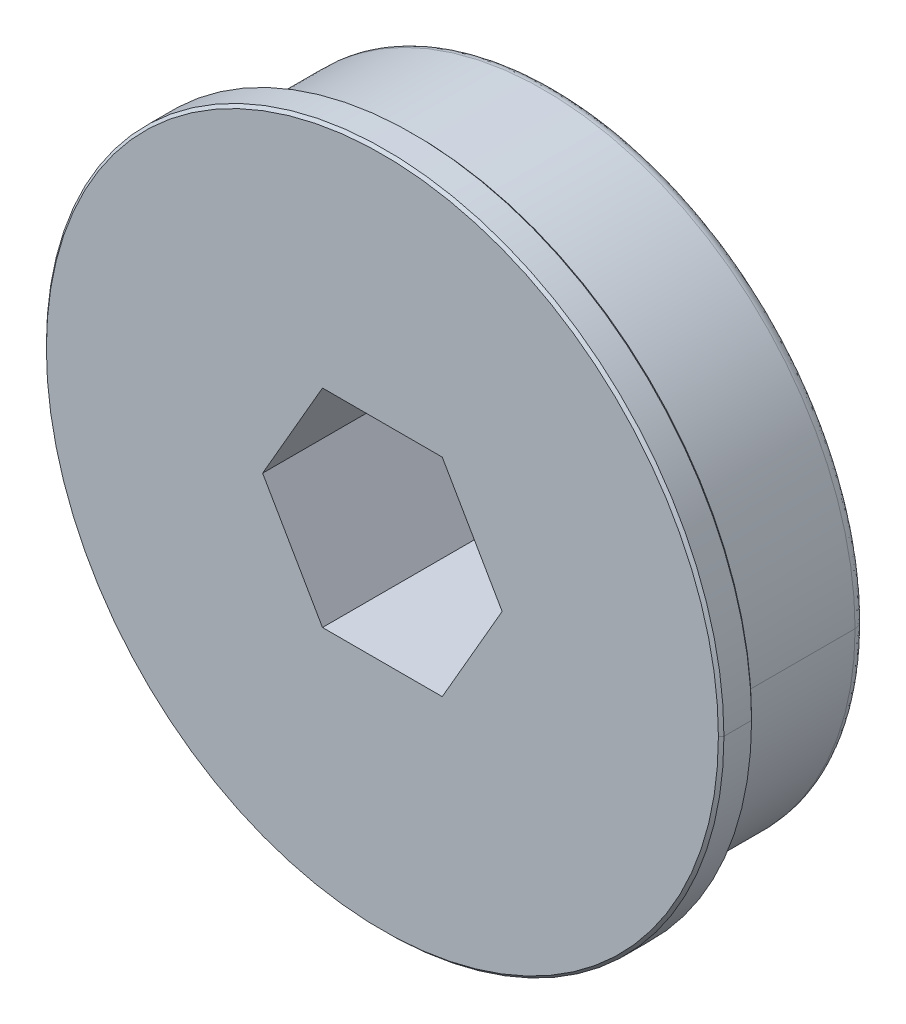
ISO-10303-21;
HEADER;
FILE_DESCRIPTION(('STEP AP214'),'2;1');
FILE_NAME('part.step','',(''),(''),'','','');
FILE_SCHEMA(('AUTOMOTIVE_DESIGN { 1 0 10303 214 1 1 1 1 }'));
ENDSEC;
DATA;
#1=APPLICATION_CONTEXT('core data for automotive mechanical design processes');
#2=APPLICATION_PROTOCOL_DEFINITION('international standard','automotive_design',2000,#1);
#3=PRODUCT_CONTEXT('',#1,'mechanical');
#4=PRODUCT('Part','Part','',(#3));
#5=PRODUCT_RELATED_PRODUCT_CATEGORY('part','',(#4));
#6=PRODUCT_DEFINITION_FORMATION('','',#4);
#7=PRODUCT_DEFINITION_CONTEXT('part definition',#1,'design');
#8=PRODUCT_DEFINITION('design','',#6,#7);
#9=PRODUCT_DEFINITION_SHAPE('','',#8);
#10=(LENGTH_UNIT() NAMED_UNIT(*) SI_UNIT(.MILLI.,.METRE.));
#11=(NAMED_UNIT(*) PLANE_ANGLE_UNIT() SI_UNIT($,.RADIAN.));
#12=(NAMED_UNIT(*) SI_UNIT($,.STERADIAN.) SOLID_ANGLE_UNIT());
#13=UNCERTAINTY_MEASURE_WITH_UNIT(LENGTH_MEASURE(1.E-05),#10,'distance_accuracy_value','');
#14=(GEOMETRIC_REPRESENTATION_CONTEXT(3) GLOBAL_UNCERTAINTY_ASSIGNED_CONTEXT((#13)) GLOBAL_UNIT_ASSIGNED_CONTEXT((#10,
#11,#12)) REPRESENTATION_CONTEXT('',''));
#15=CARTESIAN_POINT('',(0.,0.,0.));
#16=DIRECTION('',(0.,0.,1.));
#17=DIRECTION('',(1.,0.,0.));
#18=AXIS2_PLACEMENT_3D('',#15,#16,#17);
#19=CARTESIAN_POINT('',(13.7795,0.,0.));
#20=CARTESIAN_POINT('',(13.7795,-27.559,0.));
#21=CARTESIAN_POINT('',(-13.7795,-27.559,0.));
#22=CARTESIAN_POINT('',(-13.7795,0.,0.));
#23=CARTESIAN_POINT('',(14.0770795103145,0.,0.));
#24=CARTESIAN_POINT('',(14.0770795103145,-28.1541590206289,0.));
#25=CARTESIAN_POINT('',(-14.0770795103144,-28.1541590206289,0.));
#26=CARTESIAN_POINT('',(-14.0770795103145,0.,0.));
#27=CARTESIAN_POINT('',(14.2875,0.,0.210420489685535));
#28=CARTESIAN_POINT('',(14.2875,-28.575,0.210420489685535));
#29=CARTESIAN_POINT('',(-14.2875,-28.575,0.210420489685535));
#30=CARTESIAN_POINT('',(-14.2875,0.,0.210420489685535));
#31=CARTESIAN_POINT('',(14.2875,0.,0.508));
#32=CARTESIAN_POINT('',(14.2875,-28.575,0.508));
#33=CARTESIAN_POINT('',(-14.2875,-28.575,0.508));
#34=CARTESIAN_POINT('',(-14.2875,0.,0.508));
#35=(BOUNDED_SURFACE() B_SPLINE_SURFACE(3,3,((#19,#20,#21,#22),(#23,#24,#25,#26),(#27,#28,#29,
#30),(#31,#32,#33,#34)),.UNSPECIFIED.,.F.,.F.,.F.) B_SPLINE_SURFACE_WITH_KNOTS((4,4),(4,4),(0.,
1.),(0.,1.),.UNSPECIFIED.) GEOMETRIC_REPRESENTATION_ITEM() RATIONAL_B_SPLINE_SURFACE(((1.,
0.333333333333334,0.333333333333334,1.),(0.804737854124368,0.268245951374789,0.268245951374789,
0.804737854124368),(0.804737854124368,0.268245951374789,0.268245951374789,0.804737854124368),
(1.,0.333333333333334,0.333333333333334,1.))) REPRESENTATION_ITEM('') SURFACE());
#36=CARTESIAN_POINT('',(13.7795,0.,0.));
#37=CARTESIAN_POINT('',(13.7795162122622,-0.421234433545117,0.));
#38=CARTESIAN_POINT('',(13.7507729119708,-1.0505802437931,0.));
#39=CARTESIAN_POINT('',(13.6668957289328,-1.78043180229378,0.));
#40=CARTESIAN_POINT('',(13.6123713042394,-2.14426127651363,0.));
#41=CARTESIAN_POINT('',(13.581962633599,-2.32590193736593,0.));
#42=CARTESIAN_POINT('',(13.5682561051188,-2.40368920424742,0.));
#43=CARTESIAN_POINT('',(13.558968588118,-2.45553433091805,0.));
#44=CARTESIAN_POINT('',(13.5545355796113,-2.47990633622322,0.));
#45=CARTESIAN_POINT('',(13.4681882358548,-2.9466165925518,0.));
#46=CARTESIAN_POINT('',(13.315057365973,-3.59665927264263,0.));
#47=CARTESIAN_POINT('',(13.0817543937846,-4.33956822099774,0.));
#48=CARTESIAN_POINT('',(12.9514403350255,-4.7071541505709,0.));
#49=CARTESIAN_POINT('',(12.8828676624797,-4.88997997920639,0.));
#50=CARTESIAN_POINT('',(12.8527474507102,-4.96812666230351,0.));
#51=CARTESIAN_POINT('',(12.8325046598559,-5.02017839693249,0.));
#52=CARTESIAN_POINT('',(12.8227255948526,-5.04511098862723,0.));
#53=CARTESIAN_POINT('',(12.6406946886852,-5.50496203889733,0.));
#54=CARTESIAN_POINT('',(12.3523725033752,-6.13807724855982,0.));
#55=CARTESIAN_POINT('',(11.9611562114581,-6.84856068195707,0.));
#56=CARTESIAN_POINT('',(11.7518379632357,-7.19676465418679,0.));
#57=CARTESIAN_POINT('',(11.6591922635124,-7.34448683989904,0.));
#58=CARTESIAN_POINT('',(11.5967756016843,-7.44263316635155,0.));
#59=CARTESIAN_POINT('',(11.5658997282582,-7.4905308632128,0.));
#60=CARTESIAN_POINT('',(11.0130583441056,-8.33621173369481,0.));
#61=CARTESIAN_POINT('',(10.41595281911,-9.07115041119353,0.));
#62=CARTESIAN_POINT('',(9.40739042748505,-10.0797916314433,0.));
#63=CARTESIAN_POINT('',(8.87983719275512,-10.5556771559404,0.));
#64=CARTESIAN_POINT('',(8.22363235079802,-11.0611155346717,0.));
#65=CARTESIAN_POINT('',(7.88534841279309,-11.3013943740753,0.));
#66=CARTESIAN_POINT('',(7.73818782857104,-11.4017052302563,0.));
#67=CARTESIAN_POINT('',(7.63959593827889,-11.4679867367598,0.));
#68=CARTESIAN_POINT('',(7.58897578524338,-11.5015386025939,0.));
#69=CARTESIAN_POINT('',(7.15068488898815,-11.788108000785,0.));
#70=CARTESIAN_POINT('',(6.54997648985598,-12.1389840472023,0.));
#71=CARTESIAN_POINT('',(5.82058908364938,-12.4937105868068,0.));
#72=CARTESIAN_POINT('',(5.44875514540798,-12.6574166446385,0.));
#73=CARTESIAN_POINT('',(5.26105311750275,-12.7358553705617,0.));
#74=CARTESIAN_POINT('',(5.18022687866097,-12.7687403310303,0.));
#75=CARTESIAN_POINT('',(5.12625771663385,-12.7905010521526,0.));
#76=CARTESIAN_POINT('',(5.09811984490809,-12.8017399192917,0.));
#77=CARTESIAN_POINT('',(4.65682033840379,-12.9764654976591,0.));
#78=CARTESIAN_POINT('',(4.02471465818891,-13.1919810037368,0.));
#79=CARTESIAN_POINT('',(3.27134245990616,-13.3888929381443,0.));
#80=CARTESIAN_POINT('',(2.89067746792344,-13.4737181996772,0.));
#81=CARTESIAN_POINT('',(2.69935024872175,-13.5127231540259,0.));
#82=CARTESIAN_POINT('',(2.61713971409023,-13.5287093466573,0.));
#83=CARTESIAN_POINT('',(2.56228532323063,-13.5392045381059,0.));
#84=CARTESIAN_POINT('',(2.53324732644344,-13.5446647616305,0.));
#85=CARTESIAN_POINT('',(1.67896161734411,-13.7027863229975,0.));
#86=CARTESIAN_POINT('',(0.842468867097374,-13.7794675754757,0.));
#87=CARTESIAN_POINT('',(-0.421234433548683,-13.7795162122622,0.));
#88=CARTESIAN_POINT('',(-1.05058024379934,-13.7507729119708,0.));
#89=CARTESIAN_POINT('',(-1.78043180229845,-13.6668957289328,0.));
#90=CARTESIAN_POINT('',(-2.14426127651636,-13.6123713042393,0.));
#91=CARTESIAN_POINT('',(-2.32590193736739,-13.581962633599,0.));
#92=CARTESIAN_POINT('',(-2.40368920424828,-13.5682561051187,0.));
#93=CARTESIAN_POINT('',(-2.45553433091849,-13.5589685881179,0.));
#94=CARTESIAN_POINT('',(-2.47990633622205,-13.5545355796115,0.));
#95=CARTESIAN_POINT('',(-2.94661659257077,-13.4681882358506,0.));
#96=CARTESIAN_POINT('',(-3.59665927267583,-13.3150573659656,0.));
#97=CARTESIAN_POINT('',(-4.33956822102263,-13.0817543937791,0.));
#98=CARTESIAN_POINT('',(-4.70715415058543,-12.9514403350222,0.));
#99=CARTESIAN_POINT('',(-4.88997997921418,-12.882867662478,0.));
#100=CARTESIAN_POINT('',(-4.96812666230807,-12.8527474507091,0.));
#101=CARTESIAN_POINT('',(-5.02017839693483,-12.8325046598554,0.));
#102=CARTESIAN_POINT('',(-5.0451109886264,-12.8227255948531,0.));
#103=CARTESIAN_POINT('',(-5.50496203891068,-12.6406946886764,0.));
#104=CARTESIAN_POINT('',(-6.13807724858317,-12.3523725033599,0.));
#105=CARTESIAN_POINT('',(-6.84856068197457,-11.9611562114467,0.));
#106=CARTESIAN_POINT('',(-7.196764654197,-11.751837963229,0.));
#107=CARTESIAN_POINT('',(-7.34448683990519,-11.6591922635084,0.));
#108=CARTESIAN_POINT('',(-7.44263316635478,-11.5967756016822,0.));
#109=CARTESIAN_POINT('',(-7.49053086321308,-11.565899728258,0.));
#110=CARTESIAN_POINT('',(-8.33621173369039,-11.0130583441085,0.));
#111=CARTESIAN_POINT('',(-9.0711504112009,-10.4159528191011,0.));
#112=CARTESIAN_POINT('',(-10.0797916314396,-9.40739042748948,0.));
#113=CARTESIAN_POINT('',(-10.5556771559339,-8.87983719276289,0.));
#114=CARTESIAN_POINT('',(-11.0611155346669,-8.22363235080384,0.));
#115=CARTESIAN_POINT('',(-11.3013943740725,-7.88534841279649,0.));
#116=CARTESIAN_POINT('',(-11.4017052302547,-7.73818782857308,0.));
#117=CARTESIAN_POINT('',(-11.4679867367589,-7.63959593827996,0.));
#118=CARTESIAN_POINT('',(-11.5015386025944,-7.58897578524255,0.));
#119=CARTESIAN_POINT('',(-11.7881080007815,-7.15068488899471,0.));
#120=CARTESIAN_POINT('',(-12.1389840471961,-6.54997648986748,0.));
#121=CARTESIAN_POINT('',(-12.4937105868022,-5.82058908365799,0.));
#122=CARTESIAN_POINT('',(-12.6574166446358,-5.448755145413,0.));
#123=CARTESIAN_POINT('',(-12.7358553705602,-5.26105311750544,0.));
#124=CARTESIAN_POINT('',(-12.7687403310295,-5.18022687866254,0.));
#125=CARTESIAN_POINT('',(-12.7905010521522,-5.12625771663465,0.));
#126=CARTESIAN_POINT('',(-12.801739919292,-5.09811984490717,0.));
#127=CARTESIAN_POINT('',(-12.9764654976542,-4.65682033841831,0.));
#128=CARTESIAN_POINT('',(-13.1919810037283,-4.02471465821433,0.));
#129=CARTESIAN_POINT('',(-13.3888929381379,-3.27134245992523,0.));
#130=CARTESIAN_POINT('',(-13.4737181996735,-2.89067746793455,0.));
#131=CARTESIAN_POINT('',(-13.5127231540239,-2.6993502487277,0.));
#132=CARTESIAN_POINT('',(-13.5287093466561,-2.61713971409371,0.));
#133=CARTESIAN_POINT('',(-13.5392045381053,-2.56228532323241,0.));
#134=CARTESIAN_POINT('',(-13.5446617205483,-2.53326375654262,0.));
#135=CARTESIAN_POINT('',(-13.7028836376273,-1.67843585416977,0.));
#136=CARTESIAN_POINT('',(-13.7795648629285,-0.84264922726539,0.));
#137=CARTESIAN_POINT('',(-13.7795,0.,0.));
#138=(BOUNDED_CURVE() B_SPLINE_CURVE(3,(#36,#37,#38,#39,#40,#41,#42,#43,#44,#45,#46,#47,#48,#49,
#50,#51,#52,#53,#54,#55,#56,#57,#58,#59,#60,#61,#62,#63,#64,#65,#66,#67,#68,#69,#70,#71,#72,#73,
#74,#75,#76,#77,#78,#79,#80,#81,#82,#83,#84,#85,#86,#87,#88,#89,#90,#91,#92,#93,#94,#95,#96,#97,
#98,#99,#100,#101,#102,#103,#104,#105,#106,#107,#108,#109,#110,#111,#112,#113,#114,#115,#116,
#117,#118,#119,#120,#121,#122,#123,#124,#125,#126,#127,#128,#129,#130,#131,#132,#133,#134,#135,
#136,#137),.UNSPECIFIED.,.F.,.F.) B_SPLINE_CURVE_WITH_KNOTS((4,1,1,1,1,2,2,1,1,1,1,2,2,1,1,1,2,
2,2,1,1,1,2,2,1,1,1,1,2,2,1,1,1,1,2,2,2,1,1,1,1,2,2,1,1,1,1,2,2,1,1,1,2,2,2,1,1,1,2,2,1,1,1,1,2,
2,1,1,1,1,2,2,4),(0.5,0.515625,0.5234375,0.527343750000001,0.529296875000001,0.530273437500001,
0.53125,0.546875,0.5546875,0.558593750000001,0.560546875000001,0.561523437500001,0.5625,
0.578125,0.5859375,0.589843750000002,0.591796875000002,0.59375,0.625,0.640625,0.6484375,
0.652343750000004,0.654296875000004,0.65625,0.671875,0.6796875,0.683593750000004,
0.685546875000004,0.686523437500004,0.6875,0.703125,0.7109375,0.714843750000005,
0.716796875000005,0.717773437500005,0.71875,0.75,0.765625,0.7734375,0.777343750000004,
0.779296875000004,0.780273437500004,0.78125,0.796875,0.8046875,0.808593750000003,
0.810546875000003,0.811523437500003,0.8125,0.828125,0.8359375,0.839843750000002,
0.841796875000002,0.84375,0.875,0.890625,0.8984375,0.902343750000001,0.904296875000001,0.90625,
0.921875,0.9296875,0.933593750000001,0.935546875000001,0.936523437500001,0.9375,0.953125,
0.9609375,0.964843750000001,0.966796875000001,0.9677734375,0.96875,1.),
.UNSPECIFIED.) CURVE() GEOMETRIC_REPRESENTATION_ITEM() RATIONAL_B_SPLINE_CURVE((1.,1.,1.,1.,1.,
1.,1.,1.,1.,1.,1.,1.,1.,1.,1.,1.,1.,1.,1.,1.,1.,1.,1.,1.,1.,1.,1.,1.,1.,1.,1.,1.,1.,1.,1.,1.,1.,
1.,1.,1.,1.,1.,1.,1.,1.,1.,1.,1.,1.,1.,1.,1.,1.,1.,1.,1.,1.,1.,1.,1.,1.,1.,1.,1.,1.,1.,1.,1.,1.,
1.,1.,1.,1.,1.,1.,1.,1.,1.,1.,1.,1.,1.,1.,1.,1.,1.,1.,1.,1.,1.,1.,1.,1.,1.,1.,1.,1.,1.,1.,1.,1.,1.)) REPRESENTATION_ITEM(''));
#139=CARTESIAN_POINT('',(13.7795,0.,0.));
#140=VERTEX_POINT('',#139);
#141=CARTESIAN_POINT('',(-13.7795,0.,0.));
#142=VERTEX_POINT('',#141);
#143=EDGE_CURVE('E44',#140,#142,#138,.T.);
#144=CARTESIAN_POINT('',(13.7795,0.,0.508));
#145=DIRECTION('',(0.,-1.,0.));
#146=DIRECTION('',(1.,0.,0.));
#147=AXIS2_PLACEMENT_3D('',#144,#145,#146);
#148=CIRCLE('',#147,0.508);
#149=CARTESIAN_POINT('',(14.2875,0.,0.508));
#150=VERTEX_POINT('',#149);
#151=EDGE_CURVE('E11',#140,#150,#148,.T.);
#152=CARTESIAN_POINT('',(0.,0.,0.508));
#153=DIRECTION('',(0.,0.,-1.));
#154=DIRECTION('',(-1.,0.,0.));
#155=AXIS2_PLACEMENT_3D('',#152,#153,#154);
#156=CIRCLE('',#155,14.2875);
#157=CARTESIAN_POINT('',(-14.2875,0.,0.508));
#158=VERTEX_POINT('',#157);
#159=EDGE_CURVE('E30',#150,#158,#156,.T.);
#160=CARTESIAN_POINT('',(-13.7795,0.,0.508));
#161=DIRECTION('',(0.,1.,0.));
#162=DIRECTION('',(-1.,0.,0.));
#163=AXIS2_PLACEMENT_3D('',#160,#161,#162);
#164=CIRCLE('',#163,0.508);
#165=EDGE_CURVE('E212',#142,#158,#164,.T.);
#166=ORIENTED_EDGE('',*,*,#143,.F.);
#167=ORIENTED_EDGE('',*,*,#151,.T.);
#168=ORIENTED_EDGE('',*,*,#159,.T.);
#169=ORIENTED_EDGE('',*,*,#165,.F.);
#170=EDGE_LOOP('',(#166,#167,#168,#169));
#171=FACE_BOUND('',#170,.T.);
#172=ADVANCED_FACE('F19',(#171),#35,.T.);
#173=CARTESIAN_POINT('',(0.,0.,7.80034));
#174=DIRECTION('',(0.,0.,-1.));
#175=DIRECTION('',(-1.,0.,0.));
#176=AXIS2_PLACEMENT_3D('',#173,#174,#175);
#177=CONICAL_SURFACE('',#176,15.5575,0.785398163400003);
#178=CARTESIAN_POINT('',(0.,0.,7.92733999999967));
#179=DIRECTION('',(0.,0.,-1.));
#180=DIRECTION('',(-1.,0.,0.));
#181=AXIS2_PLACEMENT_3D('',#178,#179,#180);
#182=CIRCLE('',#181,15.4304999999997);
#183=CARTESIAN_POINT('',(-15.4304999999997,0.,7.92733999999967));
#184=VERTEX_POINT('',#183);
#185=CARTESIAN_POINT('',(15.4304999999997,0.,7.92733999999967));
#186=VERTEX_POINT('',#185);
#187=EDGE_CURVE('E163',#184,#186,#182,.T.);
#188=ORIENTED_EDGE('',*,*,#187,.T.);
#189=DIRECTION('',(0.707106781188354,0.,-0.707106781184742));
#190=VECTOR('',#189,1.);
#191=CARTESIAN_POINT('',(15.5575,0.,7.80034));
#192=LINE('',#191,#190);
#193=CARTESIAN_POINT('',(15.5575,0.,7.80034));
#194=VERTEX_POINT('',#193);
#195=EDGE_CURVE('E179',#186,#194,#192,.T.);
#196=ORIENTED_EDGE('',*,*,#195,.T.);
#197=CARTESIAN_POINT('',(0.,0.,7.80034));
#198=DIRECTION('',(0.,0.,1.));
#199=DIRECTION('',(-1.,0.,0.));
#200=AXIS2_PLACEMENT_3D('',#197,#198,#199);
#201=CIRCLE('',#200,15.5575);
#202=CARTESIAN_POINT('',(-15.5575,0.,7.80034));
#203=VERTEX_POINT('',#202);
#204=EDGE_CURVE('E166',#194,#203,#201,.T.);
#205=ORIENTED_EDGE('',*,*,#204,.T.);
#206=DIRECTION('',(-0.707106781188354,0.,-0.707106781184742));
#207=VECTOR('',#206,1.);
#208=CARTESIAN_POINT('',(-15.5575,0.,7.80034));
#209=LINE('',#208,#207);
#210=EDGE_CURVE('E159',#184,#203,#209,.T.);
#211=ORIENTED_EDGE('',*,*,#210,.F.);
#212=EDGE_LOOP('',(#188,#196,#205,#211));
#213=FACE_BOUND('',#212,.T.);
#214=ADVANCED_FACE('F161',(#213),#177,.T.);
#215=CARTESIAN_POINT('',(0.,0.,7.92734));
#216=DIRECTION('',(0.,0.,1.));
#217=DIRECTION('',(1.,0.,0.));
#218=AXIS2_PLACEMENT_3D('',#215,#216,#217);
#219=CYLINDRICAL_SURFACE('',#218,15.5575);
#220=CARTESIAN_POINT('',(0.,0.,6.53034));
#221=DIRECTION('',(0.,0.,1.));
#222=DIRECTION('',(1.,0.,0.));
#223=AXIS2_PLACEMENT_3D('',#220,#221,#222);
#224=CIRCLE('',#223,15.5575);
#225=CARTESIAN_POINT('',(15.5575000000007,0.,6.53034));
#226=VERTEX_POINT('',#225);
#227=CARTESIAN_POINT('',(-15.5575000000007,0.,6.53034));
#228=VERTEX_POINT('',#227);
#229=EDGE_CURVE('E220',#226,#228,#224,.T.);
#230=ORIENTED_EDGE('',*,*,#229,.T.);
#231=DIRECTION('',(0.,0.,1.));
#232=VECTOR('',#231,1.);
#233=CARTESIAN_POINT('',(-15.5575,0.,7.92734));
#234=LINE('',#233,#232);
#235=EDGE_CURVE('E194',#228,#203,#234,.T.);
#236=ORIENTED_EDGE('',*,*,#235,.T.);
#237=ORIENTED_EDGE('',*,*,#204,.F.);
#238=DIRECTION('',(0.,0.,1.));
#239=VECTOR('',#238,1.);
#240=CARTESIAN_POINT('',(15.5575,0.,7.92734));
#241=LINE('',#240,#239);
#242=EDGE_CURVE('E269',#226,#194,#241,.T.);
#243=ORIENTED_EDGE('',*,*,#242,.F.);
#244=EDGE_LOOP('',(#230,#236,#237,#243));
#245=FACE_BOUND('',#244,.T.);
#246=ADVANCED_FACE('F640',(#245),#219,.T.);
#247=CARTESIAN_POINT('',(0.,0.,6.53033999999968));
#248=DIRECTION('',(0.,0.,1.));
#249=DIRECTION('',(1.,0.,0.));
#250=AXIS2_PLACEMENT_3D('',#247,#248,#249);
#251=CONICAL_SURFACE('',#250,15.5575000000004,0.785398163400003);
#252=CARTESIAN_POINT('',(0.,0.,6.40334));
#253=DIRECTION('',(0.,0.,1.));
#254=DIRECTION('',(1.,0.,0.));
#255=AXIS2_PLACEMENT_3D('',#252,#253,#254);
#256=CIRCLE('',#255,15.4305);
#257=CARTESIAN_POINT('',(15.4305,0.,6.40334));
#258=VERTEX_POINT('',#257);
#259=CARTESIAN_POINT('',(-15.4305,0.,6.40334));
#260=VERTEX_POINT('',#259);
#261=EDGE_CURVE('E207',#258,#260,#256,.T.);
#262=ORIENTED_EDGE('',*,*,#261,.T.);
#263=DIRECTION('',(-0.707106781188354,0.,0.707106781184742));
#264=VECTOR('',#263,1.);
#265=CARTESIAN_POINT('',(-15.5575000000003,0.,6.53033999999968));
#266=LINE('',#265,#264);
#267=EDGE_CURVE('E204',#260,#228,#266,.T.);
#268=ORIENTED_EDGE('',*,*,#267,.T.);
#269=ORIENTED_EDGE('',*,*,#229,.F.);
#270=DIRECTION('',(0.707106781188354,0.,0.707106781184742));
#271=VECTOR('',#270,1.);
#272=CARTESIAN_POINT('',(15.5575000000004,0.,6.53033999999968));
#273=LINE('',#272,#271);
#274=EDGE_CURVE('E232',#258,#226,#273,.T.);
#275=ORIENTED_EDGE('',*,*,#274,.F.);
#276=EDGE_LOOP('',(#262,#268,#269,#275));
#277=FACE_BOUND('',#276,.T.);
#278=ADVANCED_FACE('F718',(#277),#251,.T.);
#279=CARTESIAN_POINT('',(0.,0.,6.40334));
#280=DIRECTION('',(0.,0.,1.));
#281=DIRECTION('',(1.,0.,0.));
#282=AXIS2_PLACEMENT_3D('',#279,#280,#281);
#283=CYLINDRICAL_SURFACE('',#282,14.2875);
#284=CARTESIAN_POINT('',(0.,0.,0.508));
#285=DIRECTION('',(0.,0.,-1.));
#286=DIRECTION('',(-1.,0.,0.));
#287=AXIS2_PLACEMENT_3D('',#284,#285,#286);
#288=CIRCLE('',#287,14.2875);
#289=EDGE_CURVE('E209',#158,#150,#288,.T.);
#290=ORIENTED_EDGE('',*,*,#289,.F.);
#291=DIRECTION('',(0.,0.,1.));
#292=VECTOR('',#291,1.);
#293=CARTESIAN_POINT('',(-14.2875,0.,6.40334));
#294=LINE('',#293,#292);
#295=CARTESIAN_POINT('',(-14.2875,0.,5.89534));
#296=VERTEX_POINT('',#295);
#297=EDGE_CURVE('E208',#158,#296,#294,.T.);
#298=ORIENTED_EDGE('',*,*,#297,.T.);
#299=CARTESIAN_POINT('',(0.,0.,5.89534));
#300=DIRECTION('',(0.,0.,-1.));
#301=DIRECTION('',(1.,0.,0.));
#302=AXIS2_PLACEMENT_3D('',#299,#300,#301);
#303=CIRCLE('',#302,14.2875);
#304=CARTESIAN_POINT('',(14.2875,0.,5.89534));
#305=VERTEX_POINT('',#304);
#306=EDGE_CURVE('E278',#296,#305,#303,.T.);
#307=ORIENTED_EDGE('',*,*,#306,.T.);
#308=DIRECTION('',(0.,0.,1.));
#309=VECTOR('',#308,1.);
#310=CARTESIAN_POINT('',(14.2875,0.,6.40334));
#311=LINE('',#310,#309);
#312=EDGE_CURVE('E294',#150,#305,#311,.T.);
#313=ORIENTED_EDGE('',*,*,#312,.F.);
#314=EDGE_LOOP('',(#290,#298,#307,#313));
#315=FACE_BOUND('',#314,.T.);
#316=ADVANCED_FACE('F722',(#315),#283,.T.);
#317=CARTESIAN_POINT('',(0.,0.,-57.007125));
#318=DIRECTION('',(0.,0.,-1.));
#319=DIRECTION('',(-1.,0.,0.));
#320=AXIS2_PLACEMENT_3D('',#317,#318,#319);
#321=CYLINDRICAL_SURFACE('',#320,13.97);
#322=CARTESIAN_POINT('',(0.,0.,6.40334));
#323=DIRECTION('',(0.,0.,1.));
#324=DIRECTION('',(-1.,0.,0.));
#325=AXIS2_PLACEMENT_3D('',#322,#323,#324);
#326=CIRCLE('',#325,13.97);
#327=CARTESIAN_POINT('',(13.97,0.,6.40334));
#328=VERTEX_POINT('',#327);
#329=CARTESIAN_POINT('',(-13.97,0.,6.40334));
#330=VERTEX_POINT('',#329);
#331=EDGE_CURVE('E297',#328,#330,#326,.T.);
#332=ORIENTED_EDGE('',*,*,#331,.F.);
#333=DIRECTION('',(0.,0.,-1.));
#334=VECTOR('',#333,1.);
#335=CARTESIAN_POINT('',(13.97,0.,-57.007125));
#336=LINE('',#335,#334);
#337=CARTESIAN_POINT('',(13.97,0.,5.89534));
#338=VERTEX_POINT('',#337);
#339=EDGE_CURVE('E190',#328,#338,#336,.T.);
#340=ORIENTED_EDGE('',*,*,#339,.T.);
#341=CARTESIAN_POINT('',(0.,0.,5.89534));
#342=DIRECTION('',(0.,0.,1.));
#343=DIRECTION('',(-1.,0.,0.));
#344=AXIS2_PLACEMENT_3D('',#341,#342,#343);
#345=CIRCLE('',#344,13.97);
#346=CARTESIAN_POINT('',(-13.97,0.,5.89534));
#347=VERTEX_POINT('',#346);
#348=EDGE_CURVE('E183',#338,#347,#345,.T.);
#349=ORIENTED_EDGE('',*,*,#348,.T.);
#350=DIRECTION('',(0.,0.,-1.));
#351=VECTOR('',#350,1.);
#352=CARTESIAN_POINT('',(-13.97,0.,-57.007125));
#353=LINE('',#352,#351);
#354=EDGE_CURVE('E330',#330,#347,#353,.T.);
#355=ORIENTED_EDGE('',*,*,#354,.F.);
#356=EDGE_LOOP('',(#332,#340,#349,#355));
#357=FACE_BOUND('',#356,.T.);
#358=ADVANCED_FACE('F591',(#357),#321,.T.);
#359=CARTESIAN_POINT('',(0.,0.,7.92734));
#360=DIRECTION('',(0.,0.,-1.));
#361=DIRECTION('',(0.,-1.,0.));
#362=AXIS2_PLACEMENT_3D('',#359,#360,#361);
#363=PLANE('',#362);
#364=ORIENTED_EDGE('',*,*,#187,.F.);
#365=CARTESIAN_POINT('',(0.,0.,7.92733999999967));
#366=DIRECTION('',(0.,0.,-1.));
#367=DIRECTION('',(-1.,0.,0.));
#368=AXIS2_PLACEMENT_3D('',#365,#366,#367);
#369=CIRCLE('',#368,15.4304999999997);
#370=EDGE_CURVE('E173',#186,#184,#369,.T.);
#371=ORIENTED_EDGE('',*,*,#370,.F.);
#372=EDGE_LOOP('',(#364,#371));
#373=FACE_BOUND('',#372,.T.);
#374=DIRECTION('',(-0.5,-0.866025403784439,0.));
#375=VECTOR('',#374,1.);
#376=CARTESIAN_POINT('',(-2.74963065701558,4.7625,7.92734));
#377=LINE('',#376,#375);
#378=CARTESIAN_POINT('',(-2.74963065701558,4.7625,7.92734));
#379=VERTEX_POINT('',#378);
#380=CARTESIAN_POINT('',(-5.49926131403117,0.,7.92734));
#381=VERTEX_POINT('',#380);
#382=EDGE_CURVE('E218',#379,#381,#377,.T.);
#383=ORIENTED_EDGE('',*,*,#382,.F.);
#384=DIRECTION('',(-1.,0.,0.));
#385=VECTOR('',#384,1.);
#386=CARTESIAN_POINT('',(0.,4.7625,7.92734));
#387=LINE('',#386,#385);
#388=CARTESIAN_POINT('',(2.7496306570156,4.7625,7.92734));
#389=VERTEX_POINT('',#388);
#390=EDGE_CURVE('E219',#389,#379,#387,.T.);
#391=ORIENTED_EDGE('',*,*,#390,.F.);
#392=DIRECTION('',(-0.5,0.866025403784438,0.));
#393=VECTOR('',#392,1.);
#394=CARTESIAN_POINT('',(5.4992613140312,0.,7.92734));
#395=LINE('',#394,#393);
#396=CARTESIAN_POINT('',(5.4992613140312,0.,7.92734));
#397=VERTEX_POINT('',#396);
#398=EDGE_CURVE('E233',#397,#389,#395,.T.);
#399=ORIENTED_EDGE('',*,*,#398,.F.);
#400=DIRECTION('',(0.5,0.866025403784439,0.));
#401=VECTOR('',#400,1.);
#402=CARTESIAN_POINT('',(2.74963065701561,-4.7625,7.92734));
#403=LINE('',#402,#401);
#404=CARTESIAN_POINT('',(2.74963065701561,-4.7625,7.92734));
#405=VERTEX_POINT('',#404);
#406=EDGE_CURVE('E248',#405,#397,#403,.T.);
#407=ORIENTED_EDGE('',*,*,#406,.F.);
#408=DIRECTION('',(1.,0.,0.));
#409=VECTOR('',#408,1.);
#410=CARTESIAN_POINT('',(0.,-4.7625,7.92734));
#411=LINE('',#410,#409);
#412=CARTESIAN_POINT('',(-2.74963065701557,-4.7625,7.92734));
#413=VERTEX_POINT('',#412);
#414=EDGE_CURVE('E203',#413,#405,#411,.T.);
#415=ORIENTED_EDGE('',*,*,#414,.F.);
#416=DIRECTION('',(0.5,-0.866025403784438,0.));
#417=VECTOR('',#416,1.);
#418=CARTESIAN_POINT('',(-5.49926131403117,0.,7.92734));
#419=LINE('',#418,#417);
#420=EDGE_CURVE('E198',#381,#413,#419,.T.);
#421=ORIENTED_EDGE('',*,*,#420,.F.);
#422=EDGE_LOOP('',(#383,#391,#399,#407,#415,#421));
#423=FACE_BOUND('',#422,.T.);
#424=ADVANCED_FACE('F176',(#373,#423),#363,.F.);
#425=CARTESIAN_POINT('',(0.,0.,7.80034));
#426=DIRECTION('',(0.,0.,-1.));
#427=DIRECTION('',(-1.,0.,0.));
#428=AXIS2_PLACEMENT_3D('',#425,#426,#427);
#429=CONICAL_SURFACE('',#428,15.5575,0.785398163400003);
#430=ORIENTED_EDGE('',*,*,#195,.F.);
#431=ORIENTED_EDGE('',*,*,#370,.T.);
#432=ORIENTED_EDGE('',*,*,#210,.T.);
#433=CARTESIAN_POINT('',(0.,0.,7.80034));
#434=DIRECTION('',(0.,0.,1.));
#435=DIRECTION('',(-1.,0.,0.));
#436=AXIS2_PLACEMENT_3D('',#433,#434,#435);
#437=CIRCLE('',#436,15.5575);
#438=EDGE_CURVE('E174',#203,#194,#437,.T.);
#439=ORIENTED_EDGE('',*,*,#438,.T.);
#440=EDGE_LOOP('',(#430,#431,#432,#439));
#441=FACE_BOUND('',#440,.T.);
#442=ADVANCED_FACE('F181',(#441),#429,.T.);
#443=CARTESIAN_POINT('',(-5.49926131403117,0.,7.92734));
#444=DIRECTION('',(-0.866025403784438,-0.5,0.));
#445=DIRECTION('',(-0.5,0.866025403784438,0.));
#446=AXIS2_PLACEMENT_3D('',#443,#444,#445);
#447=PLANE('',#446);
#448=DIRECTION('',(0.,0.,-1.));
#449=VECTOR('',#448,1.);
#450=CARTESIAN_POINT('',(-5.49926131403117,0.,7.92734));
#451=LINE('',#450,#449);
#452=CARTESIAN_POINT('',(-5.49926131403117,0.,0.));
#453=VERTEX_POINT('',#452);
#454=EDGE_CURVE('E214',#381,#453,#451,.T.);
#455=ORIENTED_EDGE('',*,*,#454,.F.);
#456=ORIENTED_EDGE('',*,*,#420,.T.);
#457=DIRECTION('',(0.,0.,1.));
#458=VECTOR('',#457,1.);
#459=CARTESIAN_POINT('',(-2.74963065701558,-4.7625,7.92734));
#460=LINE('',#459,#458);
#461=CARTESIAN_POINT('',(-2.74963065701557,-4.7625,0.));
#462=VERTEX_POINT('',#461);
#463=EDGE_CURVE('E282',#462,#413,#460,.T.);
#464=ORIENTED_EDGE('',*,*,#463,.F.);
#465=DIRECTION('',(0.5,-0.866025403784438,0.));
#466=VECTOR('',#465,1.);
#467=CARTESIAN_POINT('',(-5.49926131403117,0.,0.));
#468=LINE('',#467,#466);
#469=EDGE_CURVE('E224',#453,#462,#468,.T.);
#470=ORIENTED_EDGE('',*,*,#469,.F.);
#471=EDGE_LOOP('',(#455,#456,#464,#470));
#472=FACE_BOUND('',#471,.T.);
#473=ADVANCED_FACE('F360',(#472),#447,.F.);
#474=CARTESIAN_POINT('',(-2.74963065701558,4.7625,7.92734));
#475=DIRECTION('',(-0.866025403784439,0.5,0.));
#476=DIRECTION('',(0.,0.,1.));
#477=AXIS2_PLACEMENT_3D('',#474,#475,#476);
#478=PLANE('',#477);
#479=DIRECTION('',(0.,0.,-1.));
#480=VECTOR('',#479,1.);
#481=CARTESIAN_POINT('',(-2.74963065701558,4.7625,7.92734));
#482=LINE('',#481,#480);
#483=CARTESIAN_POINT('',(-2.74963065701558,4.7625,0.));
#484=VERTEX_POINT('',#483);
#485=EDGE_CURVE('E235',#379,#484,#482,.T.);
#486=ORIENTED_EDGE('',*,*,#485,.F.);
#487=ORIENTED_EDGE('',*,*,#382,.T.);
#488=ORIENTED_EDGE('',*,*,#454,.T.);
#489=DIRECTION('',(-0.5,-0.866025403784439,0.));
#490=VECTOR('',#489,1.);
#491=CARTESIAN_POINT('',(-2.74963065701558,4.7625,0.));
#492=LINE('',#491,#490);
#493=EDGE_CURVE('E227',#484,#453,#492,.T.);
#494=ORIENTED_EDGE('',*,*,#493,.F.);
#495=EDGE_LOOP('',(#486,#487,#488,#494));
#496=FACE_BOUND('',#495,.T.);
#497=ADVANCED_FACE('F21',(#496),#478,.F.);
#498=CARTESIAN_POINT('',(2.7496306570156,4.7625,7.92734));
#499=DIRECTION('',(0.,1.,0.));
#500=DIRECTION('',(1.,0.,0.));
#501=AXIS2_PLACEMENT_3D('',#498,#499,#500);
#502=PLANE('',#501);
#503=DIRECTION('',(0.,0.,-1.));
#504=VECTOR('',#503,1.);
#505=CARTESIAN_POINT('',(2.7496306570156,4.7625,7.92734));
#506=LINE('',#505,#504);
#507=CARTESIAN_POINT('',(2.7496306570156,4.7625,0.));
#508=VERTEX_POINT('',#507);
#509=EDGE_CURVE('E236',#389,#508,#506,.T.);
#510=ORIENTED_EDGE('',*,*,#509,.F.);
#511=ORIENTED_EDGE('',*,*,#390,.T.);
#512=ORIENTED_EDGE('',*,*,#485,.T.);
#513=DIRECTION('',(-1.,0.,0.));
#514=VECTOR('',#513,1.);
#515=CARTESIAN_POINT('',(2.7496306570156,4.7625,0.));
#516=LINE('',#515,#514);
#517=EDGE_CURVE('E260',#508,#484,#516,.T.);
#518=ORIENTED_EDGE('',*,*,#517,.F.);
#519=EDGE_LOOP('',(#510,#511,#512,#518));
#520=FACE_BOUND('',#519,.T.);
#521=ADVANCED_FACE('F599',(#520),#502,.F.);
#522=CARTESIAN_POINT('',(5.4992613140312,0.,7.92734));
#523=DIRECTION('',(0.866025403784438,0.5,0.));
#524=DIRECTION('',(0.,0.,-1.));
#525=AXIS2_PLACEMENT_3D('',#522,#523,#524);
#526=PLANE('',#525);
#527=DIRECTION('',(0.,0.,-1.));
#528=VECTOR('',#527,1.);
#529=CARTESIAN_POINT('',(5.4992613140312,0.,7.92734));
#530=LINE('',#529,#528);
#531=CARTESIAN_POINT('',(5.4992613140312,0.,0.));
#532=VERTEX_POINT('',#531);
#533=EDGE_CURVE('E255',#397,#532,#530,.T.);
#534=ORIENTED_EDGE('',*,*,#533,.F.);
#535=ORIENTED_EDGE('',*,*,#398,.T.);
#536=ORIENTED_EDGE('',*,*,#509,.T.);
#537=DIRECTION('',(-0.5,0.866025403784438,0.));
#538=VECTOR('',#537,1.);
#539=CARTESIAN_POINT('',(5.4992613140312,0.,0.));
#540=LINE('',#539,#538);
#541=EDGE_CURVE('E324',#532,#508,#540,.T.);
#542=ORIENTED_EDGE('',*,*,#541,.F.);
#543=EDGE_LOOP('',(#534,#535,#536,#542));
#544=FACE_BOUND('',#543,.T.);
#545=ADVANCED_FACE('F603',(#544),#526,.F.);
#546=CARTESIAN_POINT('',(2.74963065701561,-4.7625,7.92734));
#547=DIRECTION('',(0.866025403784439,-0.5,0.));
#548=DIRECTION('',(0.,0.,-1.));
#549=AXIS2_PLACEMENT_3D('',#546,#547,#548);
#550=PLANE('',#549);
#551=DIRECTION('',(0.,0.,-1.));
#552=VECTOR('',#551,1.);
#553=CARTESIAN_POINT('',(2.74963065701561,-4.7625,7.92734));
#554=LINE('',#553,#552);
#555=CARTESIAN_POINT('',(2.74963065701561,-4.7625,0.));
#556=VERTEX_POINT('',#555);
#557=EDGE_CURVE('E199',#405,#556,#554,.T.);
#558=ORIENTED_EDGE('',*,*,#557,.F.);
#559=ORIENTED_EDGE('',*,*,#406,.T.);
#560=ORIENTED_EDGE('',*,*,#533,.T.);
#561=DIRECTION('',(0.5,0.866025403784439,0.));
#562=VECTOR('',#561,1.);
#563=CARTESIAN_POINT('',(2.74963065701561,-4.7625,0.));
#564=LINE('',#563,#562);
#565=EDGE_CURVE('E304',#556,#532,#564,.T.);
#566=ORIENTED_EDGE('',*,*,#565,.F.);
#567=EDGE_LOOP('',(#558,#559,#560,#566));
#568=FACE_BOUND('',#567,.T.);
#569=ADVANCED_FACE('F706',(#568),#550,.F.);
#570=CARTESIAN_POINT('',(-2.74963065701557,-4.7625,7.92734));
#571=DIRECTION('',(0.,-1.,0.));
#572=DIRECTION('',(0.,0.,-1.));
#573=AXIS2_PLACEMENT_3D('',#570,#571,#572);
#574=PLANE('',#573);
#575=ORIENTED_EDGE('',*,*,#463,.T.);
#576=ORIENTED_EDGE('',*,*,#414,.T.);
#577=ORIENTED_EDGE('',*,*,#557,.T.);
#578=DIRECTION('',(1.,0.,0.));
#579=VECTOR('',#578,1.);
#580=CARTESIAN_POINT('',(-2.74963065701557,-4.7625,0.));
#581=LINE('',#580,#579);
#582=EDGE_CURVE('E228',#462,#556,#581,.T.);
#583=ORIENTED_EDGE('',*,*,#582,.F.);
#584=EDGE_LOOP('',(#575,#576,#577,#583));
#585=FACE_BOUND('',#584,.T.);
#586=ADVANCED_FACE('F616',(#585),#574,.F.);
#587=CARTESIAN_POINT('',(0.,0.,7.92734));
#588=DIRECTION('',(0.,0.,1.));
#589=DIRECTION('',(1.,0.,0.));
#590=AXIS2_PLACEMENT_3D('',#587,#588,#589);
#591=CYLINDRICAL_SURFACE('',#590,15.5575);
#592=ORIENTED_EDGE('',*,*,#235,.F.);
#593=CARTESIAN_POINT('',(0.,0.,6.53034));
#594=DIRECTION('',(0.,0.,1.));
#595=DIRECTION('',(1.,0.,0.));
#596=AXIS2_PLACEMENT_3D('',#593,#594,#595);
#597=CIRCLE('',#596,15.5575);
#598=EDGE_CURVE('E23',#228,#226,#597,.T.);
#599=ORIENTED_EDGE('',*,*,#598,.T.);
#600=ORIENTED_EDGE('',*,*,#242,.T.);
#601=ORIENTED_EDGE('',*,*,#438,.F.);
#602=EDGE_LOOP('',(#592,#599,#600,#601));
#603=FACE_BOUND('',#602,.T.);
#604=ADVANCED_FACE('F612',(#603),#591,.T.);
#605=CARTESIAN_POINT('',(0.,0.,0.));
#606=DIRECTION('',(0.,0.,-1.));
#607=DIRECTION('',(0.,-1.,0.));
#608=AXIS2_PLACEMENT_3D('',#605,#606,#607);
#609=PLANE('',#608);
#610=CARTESIAN_POINT('',(-13.7795,0.,0.));
#611=CARTESIAN_POINT('',(-13.7794675552335,0.421497426390389,0.));
#612=CARTESIAN_POINT('',(-13.7506877621706,1.05104048127232,0.));
#613=CARTESIAN_POINT('',(-13.6668318665827,1.78077698040319,0.));
#614=CARTESIAN_POINT('',(-13.6123340512018,2.14446263041079,0.));
#615=CARTESIAN_POINT('',(-13.5819426766145,2.32600980552512,0.));
#616=CARTESIAN_POINT('',(-13.5682444160279,2.40375238416924,0.));
#617=CARTESIAN_POINT('',(-13.5589626010226,2.45556669136582,0.));
#618=CARTESIAN_POINT('',(-13.5545355796112,2.47990633622309,0.));
#619=CARTESIAN_POINT('',(-13.468188235856,2.94661659255423,0.));
#620=CARTESIAN_POINT('',(-13.3150573659751,3.59665927264688,0.));
#621=CARTESIAN_POINT('',(-13.0817543937862,4.33956822100092,0.));
#622=CARTESIAN_POINT('',(-12.9514403350264,4.70715415057277,0.));
#623=CARTESIAN_POINT('',(-12.8828676624802,4.8899799792074,0.));
#624=CARTESIAN_POINT('',(-12.8527474507105,4.96812666230411,0.));
#625=CARTESIAN_POINT('',(-12.832504659856,5.0201783969328,0.));
#626=CARTESIAN_POINT('',(-12.8227255948528,5.04511098862695,0.));
#627=CARTESIAN_POINT('',(-12.6406946886811,5.50496203890198,0.));
#628=CARTESIAN_POINT('',(-12.3523725033681,6.13807724856792,0.));
#629=CARTESIAN_POINT('',(-11.9611562114528,6.84856068196315,0.));
#630=CARTESIAN_POINT('',(-11.7518379632326,7.19676465419034,0.));
#631=CARTESIAN_POINT('',(-11.6591922635106,7.34448683990119,0.));
#632=CARTESIAN_POINT('',(-11.5967756016834,7.44263316635269,0.));
#633=CARTESIAN_POINT('',(-11.5658997282574,7.49053086321375,0.));
#634=CARTESIAN_POINT('',(-11.0130583441175,8.33621173367981,0.));
#635=CARTESIAN_POINT('',(-10.4159528191133,9.07115041118719,0.));
#636=CARTESIAN_POINT('',(-9.40739042748339,10.0797916314465,0.));
#637=CARTESIAN_POINT('',(-8.87983719275224,10.5556771559459,0.));
#638=CARTESIAN_POINT('',(-8.22363235079585,11.0611155346759,0.));
#639=CARTESIAN_POINT('',(-7.88534841279182,11.3013943740777,0.));
#640=CARTESIAN_POINT('',(-7.73818782857028,11.4017052302578,0.));
#641=CARTESIAN_POINT('',(-7.63959593827849,11.4679867367606,0.));
#642=CARTESIAN_POINT('',(-7.58897578524335,11.5015386025942,0.));
#643=CARTESIAN_POINT('',(-7.15068488898832,11.7881080007829,0.));
#644=CARTESIAN_POINT('',(-6.54997648985628,12.1389840471985,0.));
#645=CARTESIAN_POINT('',(-5.8205890836496,12.493710586804,0.));
#646=CARTESIAN_POINT('',(-5.4487551454081,12.6574166446368,0.));
#647=CARTESIAN_POINT('',(-5.26105311750281,12.7358553705608,0.));
#648=CARTESIAN_POINT('',(-5.180226878661,12.7687403310298,0.));
#649=CARTESIAN_POINT('',(-5.12625771663386,12.7905010521524,0.));
#650=CARTESIAN_POINT('',(-5.09811984490713,12.8017399192919,0.));
#651=CARTESIAN_POINT('',(-4.65682033841892,12.9764654976551,0.));
#652=CARTESIAN_POINT('',(-4.0247146582154,13.1919810037299,0.));
#653=CARTESIAN_POINT('',(-3.27134245992602,13.3888929381391,0.));
#654=CARTESIAN_POINT('',(-2.89067746793502,13.4737181996741,0.));
#655=CARTESIAN_POINT('',(-2.69935024872794,13.5127231540243,0.));
#656=CARTESIAN_POINT('',(-2.61713971409386,13.5287093466563,0.));
#657=CARTESIAN_POINT('',(-2.56228532323248,13.5392045381055,0.));
#658=CARTESIAN_POINT('',(-2.53324732644352,13.5446647616304,0.));
#659=CARTESIAN_POINT('',(-1.67896161734117,13.7027863230002,0.));
#660=CARTESIAN_POINT('',(-0.8424688671022,13.7794675754784,0.));
#661=CARTESIAN_POINT('',(0.421234433551105,13.7795162122608,0.));
#662=CARTESIAN_POINT('',(1.05058024380357,13.7507729119684,0.));
#663=CARTESIAN_POINT('',(1.78043180230164,13.666895728931,0.));
#664=CARTESIAN_POINT('',(2.14426127651821,13.6123713042383,0.));
#665=CARTESIAN_POINT('',(2.32590193736839,13.5819626335984,0.));
#666=CARTESIAN_POINT('',(2.40368920424887,13.5682561051184,0.));
#667=CARTESIAN_POINT('',(2.4555343309188,13.5589685881178,0.));
#668=CARTESIAN_POINT('',(2.47990633622272,13.5545355796114,0.));
#669=CARTESIAN_POINT('',(2.94661659256,13.4681882358536,0.));
#670=CARTESIAN_POINT('',(3.59665927265698,13.3150573659709,0.));
#671=CARTESIAN_POINT('',(4.33956822100851,13.081754393783,0.));
#672=CARTESIAN_POINT('',(4.70715415057719,12.9514403350245,0.));
#673=CARTESIAN_POINT('',(4.88997997920977,12.8828676624792,0.));
#674=CARTESIAN_POINT('',(4.96812666230549,12.8527474507099,0.));
#675=CARTESIAN_POINT('',(5.02017839693351,12.8325046598558,0.));
#676=CARTESIAN_POINT('',(5.04511098862672,12.8227255948529,0.));
#677=CARTESIAN_POINT('',(5.50496203890555,12.6406946886798,0.));
#678=CARTESIAN_POINT('',(6.13807724857419,12.3523725033659,0.));
#679=CARTESIAN_POINT('',(6.84856068196785,11.9611562114511,0.));
#680=CARTESIAN_POINT('',(7.19676465419308,11.7518379632316,0.));
#681=CARTESIAN_POINT('',(7.34448683990283,11.65919226351,0.));
#682=CARTESIAN_POINT('',(7.44263316635355,11.596775601683,0.));
#683=CARTESIAN_POINT('',(7.4905308632128,11.5658997282582,0.));
#684=CARTESIAN_POINT('',(8.33621173369492,11.0130583441055,0.));
#685=CARTESIAN_POINT('',(9.07115041119207,10.4159528191115,0.));
#686=CARTESIAN_POINT('',(10.079791631444,9.40739042748432,0.));
#687=CARTESIAN_POINT('',(10.5556771559417,8.87983719275384,0.));
#688=CARTESIAN_POINT('',(11.0611155346727,8.22363235079707,0.));
#689=CARTESIAN_POINT('',(11.3013943740759,7.88534841279254,0.));
#690=CARTESIAN_POINT('',(11.4017052302567,7.7381878285707,0.));
#691=CARTESIAN_POINT('',(11.46798673676,7.63959593827872,0.));
#692=CARTESIAN_POINT('',(11.5015386025944,7.58897578524274,0.));
#693=CARTESIAN_POINT('',(11.7881080007815,7.15068488899325,0.));
#694=CARTESIAN_POINT('',(12.138984047196,6.54997648986491,0.));
#695=CARTESIAN_POINT('',(12.4937105868021,5.82058908365607,0.));
#696=CARTESIAN_POINT('',(12.6574166446357,5.44875514541188,0.));
#697=CARTESIAN_POINT('',(12.7358553705602,5.26105311750484,0.));
#698=CARTESIAN_POINT('',(12.7687403310295,5.18022687866219,0.));
#699=CARTESIAN_POINT('',(12.7905010521522,5.12625771663448,0.));
#700=CARTESIAN_POINT('',(12.801739919292,5.098119844907,0.));
#701=CARTESIAN_POINT('',(12.9764654976537,4.65682033842118,0.));
#702=CARTESIAN_POINT('',(13.1919810037274,4.02471465821935,0.));
#703=CARTESIAN_POINT('',(13.3888929381372,3.27134245992899,0.));
#704=CARTESIAN_POINT('',(13.4737181996731,2.89067746793676,0.));
#705=CARTESIAN_POINT('',(13.5127231540237,2.69935024872888,0.));
#706=CARTESIAN_POINT('',(13.528709346656,2.61713971409441,0.));
#707=CARTESIAN_POINT('',(13.5392045381053,2.56228532323278,0.));
#708=CARTESIAN_POINT('',(13.5446647616305,2.53324732644276,0.));
#709=CARTESIAN_POINT('',(13.7027863229975,1.67896161736618,0.));
#710=CARTESIAN_POINT('',(13.7794675754757,0.842468867090245,0.));
#711=CARTESIAN_POINT('',(13.7795,0.,0.));
#712=(BOUNDED_CURVE() B_SPLINE_CURVE(3,(#610,#611,#612,#613,#614,#615,#616,#617,#618,#619,#620,
#621,#622,#623,#624,#625,#626,#627,#628,#629,#630,#631,#632,#633,#634,#635,#636,#637,#638,#639,
#640,#641,#642,#643,#644,#645,#646,#647,#648,#649,#650,#651,#652,#653,#654,#655,#656,#657,#658,
#659,#660,#661,#662,#663,#664,#665,#666,#667,#668,#669,#670,#671,#672,#673,#674,#675,#676,#677,
#678,#679,#680,#681,#682,#683,#684,#685,#686,#687,#688,#689,#690,#691,#692,#693,#694,#695,#696,
#697,#698,#699,#700,#701,#702,#703,#704,#705,#706,#707,#708,#709,#710,#711),.UNSPECIFIED.,.F.,
.F.) B_SPLINE_CURVE_WITH_KNOTS((4,1,1,1,1,2,2,1,1,1,1,2,2,1,1,1,2,2,2,1,1,1,2,2,1,1,1,1,2,2,1,1,
1,1,2,2,2,1,1,1,1,2,2,1,1,1,1,2,2,1,1,1,2,2,2,1,1,1,2,2,1,1,1,1,2,2,1,1,1,1,2,2,4),(0.,
0.0156249999999996,0.0234374999999994,0.0273437499999993,0.0292968749999992,0.0302734374999992,
0.0312499999999992,0.0468749999999988,0.0546874999999986,0.0585937499999985,0.0605468749999985,
0.0615234374999985,0.0624999999999985,0.0781249999999987,0.0859374999999988,0.0898437499999989,
0.0917968749999989,0.0937499999999989,0.125,0.140625,0.1484375,0.15234375,0.154296875,0.15625,
0.171875,0.1796875,0.18359375,0.185546875,0.1865234375,0.1875,0.203125,0.2109375,0.21484375,
0.216796875,0.217773437499999,0.21875,0.25,0.265625,0.2734375,0.27734375,0.279296875,
0.2802734375,0.28125,0.296875,0.3046875,0.308593750000001,0.310546875000001,0.311523437500001,
0.3125,0.328125,0.3359375,0.339843750000001,0.341796875000001,0.34375,0.375,0.390625,0.3984375,
0.402343750000002,0.404296875000002,0.40625,0.421875,0.4296875,0.433593750000002,
0.435546875000002,0.436523437500002,0.4375,0.453125,0.4609375,0.464843750000002,
0.466796875000002,0.467773437500002,0.46875,0.5),
.UNSPECIFIED.) CURVE() GEOMETRIC_REPRESENTATION_ITEM() RATIONAL_B_SPLINE_CURVE((1.,1.,1.,1.,1.,
1.,1.,1.,1.,1.,1.,1.,1.,1.,1.,1.,1.,1.,1.,1.,1.,1.,1.,1.,1.,1.,1.,1.,1.,1.,1.,1.,1.,1.,1.,1.,1.,
1.,1.,1.,1.,1.,1.,1.,1.,1.,1.,1.,1.,1.,1.,1.,1.,1.,1.,1.,1.,1.,1.,1.,1.,1.,1.,1.,1.,1.,1.,1.,1.,
1.,1.,1.,1.,1.,1.,1.,1.,1.,1.,1.,1.,1.,1.,1.,1.,1.,1.,1.,1.,1.,1.,1.,1.,1.,1.,1.,1.,1.,1.,1.,1.,1.)) REPRESENTATION_ITEM(''));
#713=EDGE_CURVE('E268',#142,#140,#712,.T.);
#714=ORIENTED_EDGE('',*,*,#713,.T.);
#715=ORIENTED_EDGE('',*,*,#143,.T.);
#716=EDGE_LOOP('',(#714,#715));
#717=FACE_BOUND('',#716,.T.);
#718=ORIENTED_EDGE('',*,*,#517,.T.);
#719=ORIENTED_EDGE('',*,*,#493,.T.);
#720=ORIENTED_EDGE('',*,*,#469,.T.);
#721=ORIENTED_EDGE('',*,*,#582,.T.);
#722=ORIENTED_EDGE('',*,*,#565,.T.);
#723=ORIENTED_EDGE('',*,*,#541,.T.);
#724=EDGE_LOOP('',(#718,#719,#720,#721,#722,#723));
#725=FACE_BOUND('',#724,.T.);
#726=ADVANCED_FACE('F363',(#717,#725),#609,.T.);
#727=CARTESIAN_POINT('',(0.,0.,6.53033999999968));
#728=DIRECTION('',(0.,0.,1.));
#729=DIRECTION('',(1.,0.,0.));
#730=AXIS2_PLACEMENT_3D('',#727,#728,#729);
#731=CONICAL_SURFACE('',#730,15.5575000000004,0.785398163400003);
#732=ORIENTED_EDGE('',*,*,#267,.F.);
#733=CARTESIAN_POINT('',(0.,0.,6.40334));
#734=DIRECTION('',(0.,0.,1.));
#735=DIRECTION('',(1.,0.,0.));
#736=AXIS2_PLACEMENT_3D('',#733,#734,#735);
#737=CIRCLE('',#736,15.4305);
#738=EDGE_CURVE('E326',#260,#258,#737,.T.);
#739=ORIENTED_EDGE('',*,*,#738,.T.);
#740=ORIENTED_EDGE('',*,*,#274,.T.);
#741=ORIENTED_EDGE('',*,*,#598,.F.);
#742=EDGE_LOOP('',(#732,#739,#740,#741));
#743=FACE_BOUND('',#742,.T.);
#744=ADVANCED_FACE('F628',(#743),#731,.T.);
#745=CARTESIAN_POINT('',(-13.7795,0.,0.));
#746=CARTESIAN_POINT('',(-13.7795,27.559,0.));
#747=CARTESIAN_POINT('',(13.7795,27.559,0.));
#748=CARTESIAN_POINT('',(13.7795,0.,0.));
#749=CARTESIAN_POINT('',(-14.0770795103145,0.,0.));
#750=CARTESIAN_POINT('',(-14.0770795103144,28.1541590206289,0.));
#751=CARTESIAN_POINT('',(14.0770795103145,28.1541590206289,0.));
#752=CARTESIAN_POINT('',(14.0770795103145,0.,0.));
#753=CARTESIAN_POINT('',(-14.2875,0.,0.210420489685535));
#754=CARTESIAN_POINT('',(-14.2875,28.575,0.210420489685535));
#755=CARTESIAN_POINT('',(14.2875,28.575,0.210420489685535));
#756=CARTESIAN_POINT('',(14.2875,0.,0.210420489685535));
#757=CARTESIAN_POINT('',(-14.2875,0.,0.508));
#758=CARTESIAN_POINT('',(-14.2875,28.575,0.508));
#759=CARTESIAN_POINT('',(14.2875,28.575,0.508));
#760=CARTESIAN_POINT('',(14.2875,0.,0.508));
#761=(BOUNDED_SURFACE() B_SPLINE_SURFACE(3,3,((#745,#746,#747,#748),(#749,#750,#751,#752),(#753,
#754,#755,#756),(#757,#758,#759,#760)),.UNSPECIFIED.,.F.,.F.,
.F.) B_SPLINE_SURFACE_WITH_KNOTS((4,4),(4,4),(0.,1.),(0.,1.),
.UNSPECIFIED.) GEOMETRIC_REPRESENTATION_ITEM() RATIONAL_B_SPLINE_SURFACE(((1.,0.333333333333334,
0.333333333333334,1.),(0.804737854124368,0.268245951374789,0.268245951374789,0.804737854124368),
(0.804737854124368,0.268245951374789,0.268245951374789,0.804737854124368),(1.,0.333333333333334,
0.333333333333334,1.))) REPRESENTATION_ITEM('') SURFACE());
#762=ORIENTED_EDGE('',*,*,#151,.F.);
#763=ORIENTED_EDGE('',*,*,#713,.F.);
#764=ORIENTED_EDGE('',*,*,#165,.T.);
#765=ORIENTED_EDGE('',*,*,#289,.T.);
#766=EDGE_LOOP('',(#762,#763,#764,#765));
#767=FACE_BOUND('',#766,.T.);
#768=ADVANCED_FACE('F686',(#767),#761,.T.);
#769=CARTESIAN_POINT('',(0.,0.,6.40334));
#770=DIRECTION('',(0.,0.,-1.));
#771=DIRECTION('',(0.,-1.,0.));
#772=AXIS2_PLACEMENT_3D('',#769,#770,#771);
#773=PLANE('',#772);
#774=ORIENTED_EDGE('',*,*,#261,.F.);
#775=ORIENTED_EDGE('',*,*,#738,.F.);
#776=EDGE_LOOP('',(#774,#775));
#777=FACE_BOUND('',#776,.T.);
#778=CARTESIAN_POINT('',(0.,0.,6.40334));
#779=DIRECTION('',(0.,0.,1.));
#780=DIRECTION('',(-1.,0.,0.));
#781=AXIS2_PLACEMENT_3D('',#778,#779,#780);
#782=CIRCLE('',#781,13.97);
#783=EDGE_CURVE('E213',#330,#328,#782,.T.);
#784=ORIENTED_EDGE('',*,*,#783,.T.);
#785=ORIENTED_EDGE('',*,*,#331,.T.);
#786=EDGE_LOOP('',(#784,#785));
#787=FACE_BOUND('',#786,.T.);
#788=ADVANCED_FACE('F674',(#777,#787),#773,.T.);
#789=CARTESIAN_POINT('',(0.,0.,6.40334));
#790=DIRECTION('',(0.,0.,1.));
#791=DIRECTION('',(1.,0.,0.));
#792=AXIS2_PLACEMENT_3D('',#789,#790,#791);
#793=CYLINDRICAL_SURFACE('',#792,14.2875);
#794=ORIENTED_EDGE('',*,*,#297,.F.);
#795=ORIENTED_EDGE('',*,*,#159,.F.);
#796=ORIENTED_EDGE('',*,*,#312,.T.);
#797=CARTESIAN_POINT('',(0.,0.,5.89534));
#798=DIRECTION('',(0.,0.,-1.));
#799=DIRECTION('',(1.,0.,0.));
#800=AXIS2_PLACEMENT_3D('',#797,#798,#799);
#801=CIRCLE('',#800,14.2875);
#802=EDGE_CURVE('E298',#305,#296,#801,.T.);
#803=ORIENTED_EDGE('',*,*,#802,.T.);
#804=EDGE_LOOP('',(#794,#795,#796,#803));
#805=FACE_BOUND('',#804,.T.);
#806=ADVANCED_FACE('F663',(#805),#793,.T.);
#807=CARTESIAN_POINT('',(0.,0.,-57.007125));
#808=DIRECTION('',(0.,0.,-1.));
#809=DIRECTION('',(-1.,0.,0.));
#810=AXIS2_PLACEMENT_3D('',#807,#808,#809);
#811=CYLINDRICAL_SURFACE('',#810,13.97);
#812=ORIENTED_EDGE('',*,*,#339,.F.);
#813=ORIENTED_EDGE('',*,*,#783,.F.);
#814=ORIENTED_EDGE('',*,*,#354,.T.);
#815=CARTESIAN_POINT('',(0.,0.,5.89534));
#816=DIRECTION('',(0.,0.,1.));
#817=DIRECTION('',(-1.,0.,0.));
#818=AXIS2_PLACEMENT_3D('',#815,#816,#817);
#819=CIRCLE('',#818,13.97);
#820=EDGE_CURVE('E327',#347,#338,#819,.T.);
#821=ORIENTED_EDGE('',*,*,#820,.T.);
#822=EDGE_LOOP('',(#812,#813,#814,#821));
#823=FACE_BOUND('',#822,.T.);
#824=ADVANCED_FACE('F658',(#823),#811,.T.);
#825=CARTESIAN_POINT('',(0.,47.3069264516129,5.89534));
#826=DIRECTION('',(0.,0.,-1.));
#827=DIRECTION('',(0.,-1.,0.));
#828=AXIS2_PLACEMENT_3D('',#825,#826,#827);
#829=PLANE('',#828);
#830=ORIENTED_EDGE('',*,*,#802,.F.);
#831=ORIENTED_EDGE('',*,*,#306,.F.);
#832=EDGE_LOOP('',(#830,#831));
#833=FACE_BOUND('',#832,.T.);
#834=ORIENTED_EDGE('',*,*,#820,.F.);
#835=ORIENTED_EDGE('',*,*,#348,.F.);
#836=EDGE_LOOP('',(#834,#835));
#837=FACE_BOUND('',#836,.T.);
#838=ADVANCED_FACE('F662',(#833,#837),#829,.F.);
#839=CLOSED_SHELL('',(#172,#214,#246,#278,#316,#358,#424,#442,#473,#497,#521,#545,#569,#586,
#604,#726,#744,#768,#788,#806,#824,#838));
#840=MANIFOLD_SOLID_BREP('B1',#839);
#841=ADVANCED_BREP_SHAPE_REPRESENTATION('',(#18,#840),#14);
#842=SHAPE_DEFINITION_REPRESENTATION(#9,#841);
ENDSEC;
END-ISO-10303-21;
